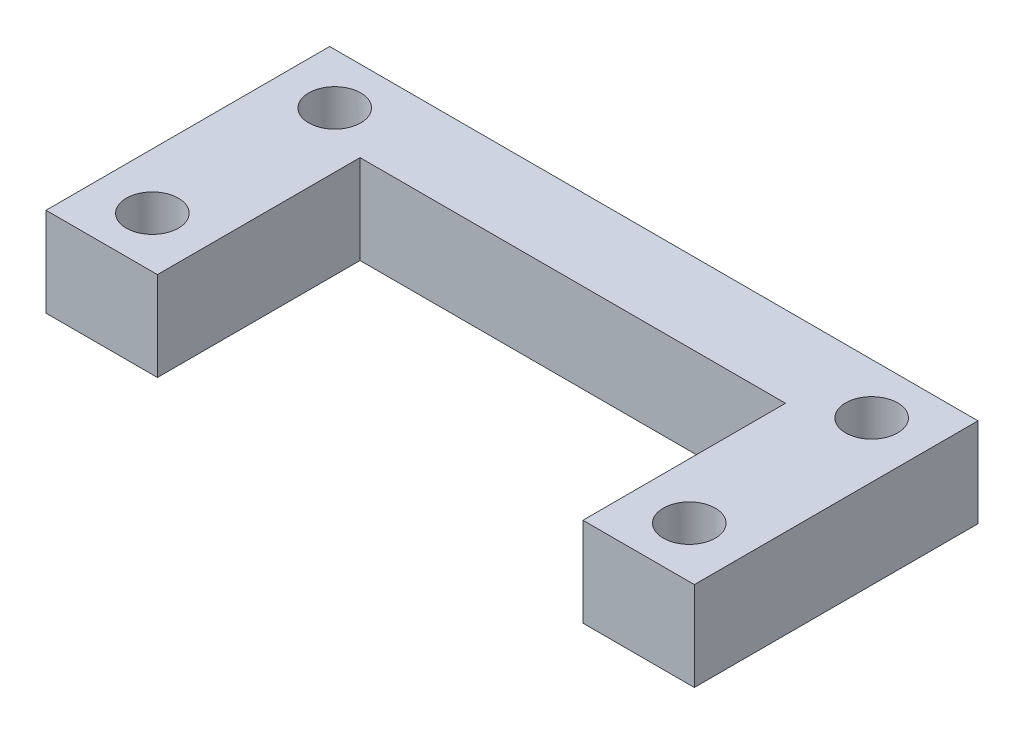
ISO-10303-21;
HEADER;
FILE_DESCRIPTION(('STEP AP214'),'2;1');
FILE_NAME('part.step','',(''),(''),'','','');
FILE_SCHEMA(('AUTOMOTIVE_DESIGN { 1 0 10303 214 1 1 1 1 }'));
ENDSEC;
DATA;
#1=APPLICATION_CONTEXT('core data for automotive mechanical design processes');
#2=APPLICATION_PROTOCOL_DEFINITION('international standard','automotive_design',2000,#1);
#3=PRODUCT_CONTEXT('',#1,'mechanical');
#4=PRODUCT('Part','Part','',(#3));
#5=PRODUCT_RELATED_PRODUCT_CATEGORY('part','',(#4));
#6=PRODUCT_DEFINITION_FORMATION('','',#4);
#7=PRODUCT_DEFINITION_CONTEXT('part definition',#1,'design');
#8=PRODUCT_DEFINITION('design','',#6,#7);
#9=PRODUCT_DEFINITION_SHAPE('','',#8);
#10=(LENGTH_UNIT() NAMED_UNIT(*) SI_UNIT(.MILLI.,.METRE.));
#11=(NAMED_UNIT(*) PLANE_ANGLE_UNIT() SI_UNIT($,.RADIAN.));
#12=(NAMED_UNIT(*) SI_UNIT($,.STERADIAN.) SOLID_ANGLE_UNIT());
#13=UNCERTAINTY_MEASURE_WITH_UNIT(LENGTH_MEASURE(1.E-05),#10,'distance_accuracy_value','');
#14=(GEOMETRIC_REPRESENTATION_CONTEXT(3) GLOBAL_UNCERTAINTY_ASSIGNED_CONTEXT((#13)) GLOBAL_UNIT_ASSIGNED_CONTEXT((#10,
#11,#12)) REPRESENTATION_CONTEXT('',''));
#15=CARTESIAN_POINT('',(0.,0.,0.));
#16=DIRECTION('',(0.,0.,1.));
#17=DIRECTION('',(1.,0.,0.));
#18=AXIS2_PLACEMENT_3D('',#15,#16,#17);
#19=CARTESIAN_POINT('',(-13.335,0.,-6.477));
#20=DIRECTION('',(0.,0.,1.));
#21=DIRECTION('',(1.,0.,0.));
#22=AXIS2_PLACEMENT_3D('',#19,#20,#21);
#23=PLANE('',#22);
#24=DIRECTION('',(1.,0.,0.));
#25=VECTOR('',#24,1.);
#26=CARTESIAN_POINT('',(-13.335,5.588,-6.477));
#27=LINE('',#26,#25);
#28=CARTESIAN_POINT('',(-13.335,5.588,-6.477));
#29=VERTEX_POINT('',#28);
#30=CARTESIAN_POINT('',(13.335,5.588,-6.477));
#31=VERTEX_POINT('',#30);
#32=EDGE_CURVE('E56',#29,#31,#27,.T.);
#33=ORIENTED_EDGE('',*,*,#32,.F.);
#34=DIRECTION('',(0.,-1.,0.));
#35=VECTOR('',#34,1.);
#36=CARTESIAN_POINT('',(-13.335,29.972,-6.477));
#37=LINE('',#36,#35);
#38=CARTESIAN_POINT('',(-13.335,0.,-6.477));
#39=VERTEX_POINT('',#38);
#40=EDGE_CURVE('E63',#29,#39,#37,.T.);
#41=ORIENTED_EDGE('',*,*,#40,.T.);
#42=DIRECTION('',(1.,0.,0.));
#43=VECTOR('',#42,1.);
#44=CARTESIAN_POINT('',(-13.335,0.,-6.477));
#45=LINE('',#44,#43);
#46=CARTESIAN_POINT('',(13.335,0.,-6.477));
#47=VERTEX_POINT('',#46);
#48=EDGE_CURVE('E171',#39,#47,#45,.T.);
#49=ORIENTED_EDGE('',*,*,#48,.T.);
#50=DIRECTION('',(0.,1.,0.));
#51=VECTOR('',#50,1.);
#52=CARTESIAN_POINT('',(13.335,29.972,-6.477));
#53=LINE('',#52,#51);
#54=EDGE_CURVE('E158',#47,#31,#53,.T.);
#55=ORIENTED_EDGE('',*,*,#54,.T.);
#56=EDGE_LOOP('',(#33,#41,#49,#55));
#57=FACE_BOUND('',#56,.T.);
#58=ADVANCED_FACE('F39',(#57),#23,.T.);
#59=CARTESIAN_POINT('',(-20.32,29.972,6.223));
#60=DIRECTION('',(0.,0.,-1.));
#61=DIRECTION('',(-1.,0.,0.));
#62=AXIS2_PLACEMENT_3D('',#59,#60,#61);
#63=PLANE('',#62);
#64=DIRECTION('',(0.,-1.,0.));
#65=VECTOR('',#64,1.);
#66=CARTESIAN_POINT('',(-13.335,29.972,6.223));
#67=LINE('',#66,#65);
#68=CARTESIAN_POINT('',(-13.335,5.588,6.223));
#69=VERTEX_POINT('',#68);
#70=CARTESIAN_POINT('',(-13.335,0.,6.223));
#71=VERTEX_POINT('',#70);
#72=EDGE_CURVE('E164',#69,#71,#67,.T.);
#73=ORIENTED_EDGE('',*,*,#72,.F.);
#74=DIRECTION('',(-1.,0.,0.));
#75=VECTOR('',#74,1.);
#76=CARTESIAN_POINT('',(20.32,5.588,6.223));
#77=LINE('',#76,#75);
#78=CARTESIAN_POINT('',(-20.32,5.588,6.223));
#79=VERTEX_POINT('',#78);
#80=EDGE_CURVE('E115',#69,#79,#77,.T.);
#81=ORIENTED_EDGE('',*,*,#80,.T.);
#82=DIRECTION('',(0.,-1.,0.));
#83=VECTOR('',#82,1.);
#84=CARTESIAN_POINT('',(-20.32,29.972,6.223));
#85=LINE('',#84,#83);
#86=CARTESIAN_POINT('',(-20.32,0.,6.223));
#87=VERTEX_POINT('',#86);
#88=EDGE_CURVE('E11',#79,#87,#85,.T.);
#89=ORIENTED_EDGE('',*,*,#88,.T.);
#90=DIRECTION('',(1.,0.,0.));
#91=VECTOR('',#90,1.);
#92=CARTESIAN_POINT('',(-20.32,0.,6.223));
#93=LINE('',#92,#91);
#94=EDGE_CURVE('E145',#87,#71,#93,.T.);
#95=ORIENTED_EDGE('',*,*,#94,.T.);
#96=EDGE_LOOP('',(#73,#81,#89,#95));
#97=FACE_BOUND('',#96,.T.);
#98=ADVANCED_FACE('F221',(#97),#63,.F.);
#99=CARTESIAN_POINT('',(-20.32,29.972,-11.557));
#100=DIRECTION('',(1.,0.,0.));
#101=DIRECTION('',(0.,0.,-1.));
#102=AXIS2_PLACEMENT_3D('',#99,#100,#101);
#103=PLANE('',#102);
#104=ORIENTED_EDGE('',*,*,#88,.F.);
#105=DIRECTION('',(0.,0.,-1.));
#106=VECTOR('',#105,1.);
#107=CARTESIAN_POINT('',(-20.32,5.588,6.223));
#108=LINE('',#107,#106);
#109=CARTESIAN_POINT('',(-20.32,5.588,-11.557));
#110=VERTEX_POINT('',#109);
#111=EDGE_CURVE('E124',#79,#110,#108,.T.);
#112=ORIENTED_EDGE('',*,*,#111,.T.);
#113=DIRECTION('',(0.,-1.,0.));
#114=VECTOR('',#113,1.);
#115=CARTESIAN_POINT('',(-20.32,29.972,-11.557));
#116=LINE('',#115,#114);
#117=CARTESIAN_POINT('',(-20.32,0.,-11.557));
#118=VERTEX_POINT('',#117);
#119=EDGE_CURVE('E133',#110,#118,#116,.T.);
#120=ORIENTED_EDGE('',*,*,#119,.T.);
#121=DIRECTION('',(0.,0.,1.));
#122=VECTOR('',#121,1.);
#123=CARTESIAN_POINT('',(-20.32,0.,-11.557));
#124=LINE('',#123,#122);
#125=EDGE_CURVE('E149',#118,#87,#124,.T.);
#126=ORIENTED_EDGE('',*,*,#125,.T.);
#127=EDGE_LOOP('',(#104,#112,#120,#126));
#128=FACE_BOUND('',#127,.T.);
#129=ADVANCED_FACE('F41',(#128),#103,.F.);
#130=DIRECTION('',(0.,-1.,0.));
#131=VECTOR('',#130,1.);
#132=CARTESIAN_POINT('',(20.32,29.972,6.223));
#133=LINE('',#132,#131);
#134=CARTESIAN_POINT('',(20.32,5.588,6.223));
#135=VERTEX_POINT('',#134);
#136=CARTESIAN_POINT('',(20.32,0.,6.223));
#137=VERTEX_POINT('',#136);
#138=EDGE_CURVE('E49',#135,#137,#133,.T.);
#139=ORIENTED_EDGE('',*,*,#138,.F.);
#140=CARTESIAN_POINT('',(13.335,5.588,6.223));
#141=VERTEX_POINT('',#140);
#142=EDGE_CURVE('E104',#135,#141,#77,.T.);
#143=ORIENTED_EDGE('',*,*,#142,.T.);
#144=DIRECTION('',(0.,1.,0.));
#145=VECTOR('',#144,1.);
#146=CARTESIAN_POINT('',(13.335,29.972,6.223));
#147=LINE('',#146,#145);
#148=CARTESIAN_POINT('',(13.335,0.,6.223));
#149=VERTEX_POINT('',#148);
#150=EDGE_CURVE('E161',#149,#141,#147,.T.);
#151=ORIENTED_EDGE('',*,*,#150,.F.);
#152=EDGE_CURVE('E128',#149,#137,#93,.T.);
#153=ORIENTED_EDGE('',*,*,#152,.T.);
#154=EDGE_LOOP('',(#139,#143,#151,#153));
#155=FACE_BOUND('',#154,.T.);
#156=ADVANCED_FACE('F126',(#155),#63,.F.);
#157=CARTESIAN_POINT('',(20.32,29.972,-11.557));
#158=DIRECTION('',(-1.,0.,0.));
#159=DIRECTION('',(0.,0.,1.));
#160=AXIS2_PLACEMENT_3D('',#157,#158,#159);
#161=PLANE('',#160);
#162=DIRECTION('',(0.,-1.,0.));
#163=VECTOR('',#162,1.);
#164=CARTESIAN_POINT('',(20.32,29.972,-11.557));
#165=LINE('',#164,#163);
#166=CARTESIAN_POINT('',(20.32,5.588,-11.557));
#167=VERTEX_POINT('',#166);
#168=CARTESIAN_POINT('',(20.32,0.,-11.557));
#169=VERTEX_POINT('',#168);
#170=EDGE_CURVE('E122',#167,#169,#165,.T.);
#171=ORIENTED_EDGE('',*,*,#170,.F.);
#172=DIRECTION('',(0.,0.,-1.));
#173=VECTOR('',#172,1.);
#174=CARTESIAN_POINT('',(20.32,5.588,6.223));
#175=LINE('',#174,#173);
#176=EDGE_CURVE('E107',#135,#167,#175,.T.);
#177=ORIENTED_EDGE('',*,*,#176,.F.);
#178=ORIENTED_EDGE('',*,*,#138,.T.);
#179=DIRECTION('',(0.,0.,-1.));
#180=VECTOR('',#179,1.);
#181=CARTESIAN_POINT('',(20.32,0.,-11.557));
#182=LINE('',#181,#180);
#183=EDGE_CURVE('E142',#137,#169,#182,.T.);
#184=ORIENTED_EDGE('',*,*,#183,.T.);
#185=EDGE_LOOP('',(#171,#177,#178,#184));
#186=FACE_BOUND('',#185,.T.);
#187=ADVANCED_FACE('F119',(#186),#161,.F.);
#188=CARTESIAN_POINT('',(-20.32,29.972,-11.557));
#189=DIRECTION('',(0.,0.,1.));
#190=DIRECTION('',(1.,0.,0.));
#191=AXIS2_PLACEMENT_3D('',#188,#189,#190);
#192=PLANE('',#191);
#193=ORIENTED_EDGE('',*,*,#119,.F.);
#194=DIRECTION('',(-1.,0.,0.));
#195=VECTOR('',#194,1.);
#196=CARTESIAN_POINT('',(20.32,5.588,-11.557));
#197=LINE('',#196,#195);
#198=EDGE_CURVE('E214',#167,#110,#197,.T.);
#199=ORIENTED_EDGE('',*,*,#198,.F.);
#200=ORIENTED_EDGE('',*,*,#170,.T.);
#201=DIRECTION('',(-1.,0.,0.));
#202=VECTOR('',#201,1.);
#203=CARTESIAN_POINT('',(-20.32,0.,-11.557));
#204=LINE('',#203,#202);
#205=EDGE_CURVE('E138',#169,#118,#204,.T.);
#206=ORIENTED_EDGE('',*,*,#205,.T.);
#207=EDGE_LOOP('',(#193,#199,#200,#206));
#208=FACE_BOUND('',#207,.T.);
#209=ADVANCED_FACE('F259',(#208),#192,.F.);
#210=CARTESIAN_POINT('',(-20.32,0.,6.223));
#211=DIRECTION('',(0.,1.,0.));
#212=DIRECTION('',(0.,0.,1.));
#213=AXIS2_PLACEMENT_3D('',#210,#211,#212);
#214=PLANE('',#213);
#215=CARTESIAN_POINT('',(-16.8275,0.,3.048));
#216=DIRECTION('',(0.,1.,0.));
#217=DIRECTION('',(0.,0.,1.));
#218=AXIS2_PLACEMENT_3D('',#215,#216,#217);
#219=CIRCLE('',#218,1.63194999999999);
#220=CARTESIAN_POINT('',(-16.8275,0.,4.67994999999999));
#221=VERTEX_POINT('',#220);
#222=EDGE_CURVE('E187',#221,#221,#219,.T.);
#223=ORIENTED_EDGE('',*,*,#222,.T.);
#224=EDGE_LOOP('',(#223));
#225=FACE_BOUND('',#224,.T.);
#226=CARTESIAN_POINT('',(-16.8275,0.,-8.382));
#227=DIRECTION('',(0.,1.,0.));
#228=DIRECTION('',(0.,0.,1.));
#229=AXIS2_PLACEMENT_3D('',#226,#227,#228);
#230=CIRCLE('',#229,1.63194999999999);
#231=CARTESIAN_POINT('',(-16.8275,0.,-6.75005));
#232=VERTEX_POINT('',#231);
#233=EDGE_CURVE('E183',#232,#232,#230,.T.);
#234=ORIENTED_EDGE('',*,*,#233,.T.);
#235=EDGE_LOOP('',(#234));
#236=FACE_BOUND('',#235,.T.);
#237=CARTESIAN_POINT('',(16.8275,0.,-8.382));
#238=DIRECTION('',(0.,1.,0.));
#239=DIRECTION('',(0.,0.,1.));
#240=AXIS2_PLACEMENT_3D('',#237,#238,#239);
#241=CIRCLE('',#240,1.63194999999999);
#242=CARTESIAN_POINT('',(16.8275,0.,-6.75005));
#243=VERTEX_POINT('',#242);
#244=EDGE_CURVE('E179',#243,#243,#241,.T.);
#245=ORIENTED_EDGE('',*,*,#244,.T.);
#246=EDGE_LOOP('',(#245));
#247=FACE_BOUND('',#246,.T.);
#248=CARTESIAN_POINT('',(16.8275,0.,3.048));
#249=DIRECTION('',(0.,1.,0.));
#250=DIRECTION('',(0.,0.,1.));
#251=AXIS2_PLACEMENT_3D('',#248,#249,#250);
#252=CIRCLE('',#251,1.63194999999999);
#253=CARTESIAN_POINT('',(16.8275,0.,4.67994999999999));
#254=VERTEX_POINT('',#253);
#255=EDGE_CURVE('E167',#254,#254,#252,.T.);
#256=ORIENTED_EDGE('',*,*,#255,.T.);
#257=EDGE_LOOP('',(#256));
#258=FACE_BOUND('',#257,.T.);
#259=ORIENTED_EDGE('',*,*,#48,.F.);
#260=DIRECTION('',(0.,0.,1.));
#261=VECTOR('',#260,1.);
#262=CARTESIAN_POINT('',(-13.335,0.,-6.477));
#263=LINE('',#262,#261);
#264=EDGE_CURVE('E154',#39,#71,#263,.T.);
#265=ORIENTED_EDGE('',*,*,#264,.T.);
#266=ORIENTED_EDGE('',*,*,#94,.F.);
#267=ORIENTED_EDGE('',*,*,#125,.F.);
#268=ORIENTED_EDGE('',*,*,#205,.F.);
#269=ORIENTED_EDGE('',*,*,#183,.F.);
#270=ORIENTED_EDGE('',*,*,#152,.F.);
#271=DIRECTION('',(0.,0.,1.));
#272=VECTOR('',#271,1.);
#273=CARTESIAN_POINT('',(13.335,0.,-6.477));
#274=LINE('',#273,#272);
#275=EDGE_CURVE('E153',#47,#149,#274,.T.);
#276=ORIENTED_EDGE('',*,*,#275,.F.);
#277=EDGE_LOOP('',(#259,#265,#266,#267,#268,#269,#270,#276));
#278=FACE_BOUND('',#277,.T.);
#279=ADVANCED_FACE('F229',(#225,#236,#247,#258,#278),#214,.F.);
#280=CARTESIAN_POINT('',(-13.335,29.972,-6.477));
#281=DIRECTION('',(-1.,0.,0.));
#282=DIRECTION('',(0.,-1.,0.));
#283=AXIS2_PLACEMENT_3D('',#280,#281,#282);
#284=PLANE('',#283);
#285=ORIENTED_EDGE('',*,*,#40,.F.);
#286=DIRECTION('',(0.,0.,1.));
#287=VECTOR('',#286,1.);
#288=CARTESIAN_POINT('',(-13.335,5.588,-6.477));
#289=LINE('',#288,#287);
#290=EDGE_CURVE('E191',#29,#69,#289,.T.);
#291=ORIENTED_EDGE('',*,*,#290,.T.);
#292=ORIENTED_EDGE('',*,*,#72,.T.);
#293=ORIENTED_EDGE('',*,*,#264,.F.);
#294=EDGE_LOOP('',(#285,#291,#292,#293));
#295=FACE_BOUND('',#294,.T.);
#296=ADVANCED_FACE('F232',(#295),#284,.F.);
#297=CARTESIAN_POINT('',(13.335,29.972,-6.477));
#298=DIRECTION('',(1.,0.,0.));
#299=DIRECTION('',(0.,1.,0.));
#300=AXIS2_PLACEMENT_3D('',#297,#298,#299);
#301=PLANE('',#300);
#302=ORIENTED_EDGE('',*,*,#150,.T.);
#303=DIRECTION('',(0.,0.,-1.));
#304=VECTOR('',#303,1.);
#305=CARTESIAN_POINT('',(13.335,5.588,-6.477));
#306=LINE('',#305,#304);
#307=EDGE_CURVE('E109',#141,#31,#306,.T.);
#308=ORIENTED_EDGE('',*,*,#307,.T.);
#309=ORIENTED_EDGE('',*,*,#54,.F.);
#310=ORIENTED_EDGE('',*,*,#275,.T.);
#311=EDGE_LOOP('',(#302,#308,#309,#310));
#312=FACE_BOUND('',#311,.T.);
#313=ADVANCED_FACE('F234',(#312),#301,.F.);
#314=CARTESIAN_POINT('',(16.8275,29.972,3.048));
#315=DIRECTION('',(0.,1.,0.));
#316=DIRECTION('',(0.,0.,1.));
#317=AXIS2_PLACEMENT_3D('',#314,#315,#316);
#318=CYLINDRICAL_SURFACE('',#317,1.63194999999999);
#319=CARTESIAN_POINT('',(16.8275,5.588,3.048));
#320=DIRECTION('',(0.,-1.,0.));
#321=DIRECTION('',(0.,0.,-1.));
#322=AXIS2_PLACEMENT_3D('',#319,#320,#321);
#323=CIRCLE('',#322,1.63194999999999);
#324=CARTESIAN_POINT('',(16.8275,5.588,1.41605));
#325=VERTEX_POINT('',#324);
#326=EDGE_CURVE('E199',#325,#325,#323,.F.);
#327=ORIENTED_EDGE('',*,*,#326,.T.);
#328=EDGE_LOOP('',(#327));
#329=FACE_BOUND('',#328,.T.);
#330=ORIENTED_EDGE('',*,*,#255,.F.);
#331=EDGE_LOOP('',(#330));
#332=FACE_BOUND('',#331,.T.);
#333=ADVANCED_FACE('F251',(#329,#332),#318,.F.);
#334=CARTESIAN_POINT('',(16.8275,29.972,-8.382));
#335=DIRECTION('',(0.,1.,0.));
#336=DIRECTION('',(0.,0.,1.));
#337=AXIS2_PLACEMENT_3D('',#334,#335,#336);
#338=CYLINDRICAL_SURFACE('',#337,1.63194999999999);
#339=CARTESIAN_POINT('',(16.8275,5.588,-8.382));
#340=DIRECTION('',(0.,-1.,0.));
#341=DIRECTION('',(0.,0.,-1.));
#342=AXIS2_PLACEMENT_3D('',#339,#340,#341);
#343=CIRCLE('',#342,1.63194999999999);
#344=CARTESIAN_POINT('',(16.8275,5.588,-10.01395));
#345=VERTEX_POINT('',#344);
#346=EDGE_CURVE('E203',#345,#345,#343,.F.);
#347=ORIENTED_EDGE('',*,*,#346,.T.);
#348=EDGE_LOOP('',(#347));
#349=FACE_BOUND('',#348,.T.);
#350=ORIENTED_EDGE('',*,*,#244,.F.);
#351=EDGE_LOOP('',(#350));
#352=FACE_BOUND('',#351,.T.);
#353=ADVANCED_FACE('F254',(#349,#352),#338,.F.);
#354=CARTESIAN_POINT('',(-16.8275,29.972,-8.382));
#355=DIRECTION('',(0.,1.,0.));
#356=DIRECTION('',(0.,0.,1.));
#357=AXIS2_PLACEMENT_3D('',#354,#355,#356);
#358=CYLINDRICAL_SURFACE('',#357,1.63194999999999);
#359=CARTESIAN_POINT('',(-16.8275,5.588,-8.382));
#360=DIRECTION('',(0.,-1.,0.));
#361=DIRECTION('',(0.,0.,-1.));
#362=AXIS2_PLACEMENT_3D('',#359,#360,#361);
#363=CIRCLE('',#362,1.63194999999999);
#364=CARTESIAN_POINT('',(-16.8275,5.588,-10.01395));
#365=VERTEX_POINT('',#364);
#366=EDGE_CURVE('E207',#365,#365,#363,.F.);
#367=ORIENTED_EDGE('',*,*,#366,.T.);
#368=EDGE_LOOP('',(#367));
#369=FACE_BOUND('',#368,.T.);
#370=ORIENTED_EDGE('',*,*,#233,.F.);
#371=EDGE_LOOP('',(#370));
#372=FACE_BOUND('',#371,.T.);
#373=ADVANCED_FACE('F292',(#369,#372),#358,.F.);
#374=CARTESIAN_POINT('',(-16.8275,29.972,3.048));
#375=DIRECTION('',(0.,1.,0.));
#376=DIRECTION('',(0.,0.,1.));
#377=AXIS2_PLACEMENT_3D('',#374,#375,#376);
#378=CYLINDRICAL_SURFACE('',#377,1.63194999999999);
#379=CARTESIAN_POINT('',(-16.8275,5.588,3.048));
#380=DIRECTION('',(0.,-1.,0.));
#381=DIRECTION('',(0.,0.,-1.));
#382=AXIS2_PLACEMENT_3D('',#379,#380,#381);
#383=CIRCLE('',#382,1.63194999999999);
#384=CARTESIAN_POINT('',(-16.8275,5.588,1.41605));
#385=VERTEX_POINT('',#384);
#386=EDGE_CURVE('E43',#385,#385,#383,.F.);
#387=ORIENTED_EDGE('',*,*,#386,.T.);
#388=EDGE_LOOP('',(#387));
#389=FACE_BOUND('',#388,.T.);
#390=ORIENTED_EDGE('',*,*,#222,.F.);
#391=EDGE_LOOP('',(#390));
#392=FACE_BOUND('',#391,.T.);
#393=ADVANCED_FACE('F240',(#389,#392),#378,.F.);
#394=CARTESIAN_POINT('',(20.32,5.588,6.223));
#395=DIRECTION('',(0.,-1.,0.));
#396=DIRECTION('',(0.,0.,-1.));
#397=AXIS2_PLACEMENT_3D('',#394,#395,#396);
#398=PLANE('',#397);
#399=ORIENTED_EDGE('',*,*,#346,.F.);
#400=EDGE_LOOP('',(#399));
#401=FACE_BOUND('',#400,.T.);
#402=ORIENTED_EDGE('',*,*,#386,.F.);
#403=EDGE_LOOP('',(#402));
#404=FACE_BOUND('',#403,.T.);
#405=ORIENTED_EDGE('',*,*,#366,.F.);
#406=EDGE_LOOP('',(#405));
#407=FACE_BOUND('',#406,.T.);
#408=ORIENTED_EDGE('',*,*,#326,.F.);
#409=EDGE_LOOP('',(#408));
#410=FACE_BOUND('',#409,.T.);
#411=ORIENTED_EDGE('',*,*,#32,.T.);
#412=ORIENTED_EDGE('',*,*,#307,.F.);
#413=ORIENTED_EDGE('',*,*,#142,.F.);
#414=ORIENTED_EDGE('',*,*,#176,.T.);
#415=ORIENTED_EDGE('',*,*,#198,.T.);
#416=ORIENTED_EDGE('',*,*,#111,.F.);
#417=ORIENTED_EDGE('',*,*,#80,.F.);
#418=ORIENTED_EDGE('',*,*,#290,.F.);
#419=EDGE_LOOP('',(#411,#412,#413,#414,#415,#416,#417,#418));
#420=FACE_BOUND('',#419,.T.);
#421=ADVANCED_FACE('F106',(#401,#404,#407,#410,#420),#398,.F.);
#422=CLOSED_SHELL('',(#58,#98,#129,#156,#187,#209,#279,#296,#313,#333,#353,#373,#393,#421));
#423=MANIFOLD_SOLID_BREP('B2',#422);
#424=ADVANCED_BREP_SHAPE_REPRESENTATION('',(#18,#423),#14);
#425=SHAPE_DEFINITION_REPRESENTATION(#9,#424);
ENDSEC;
END-ISO-10303-21;
